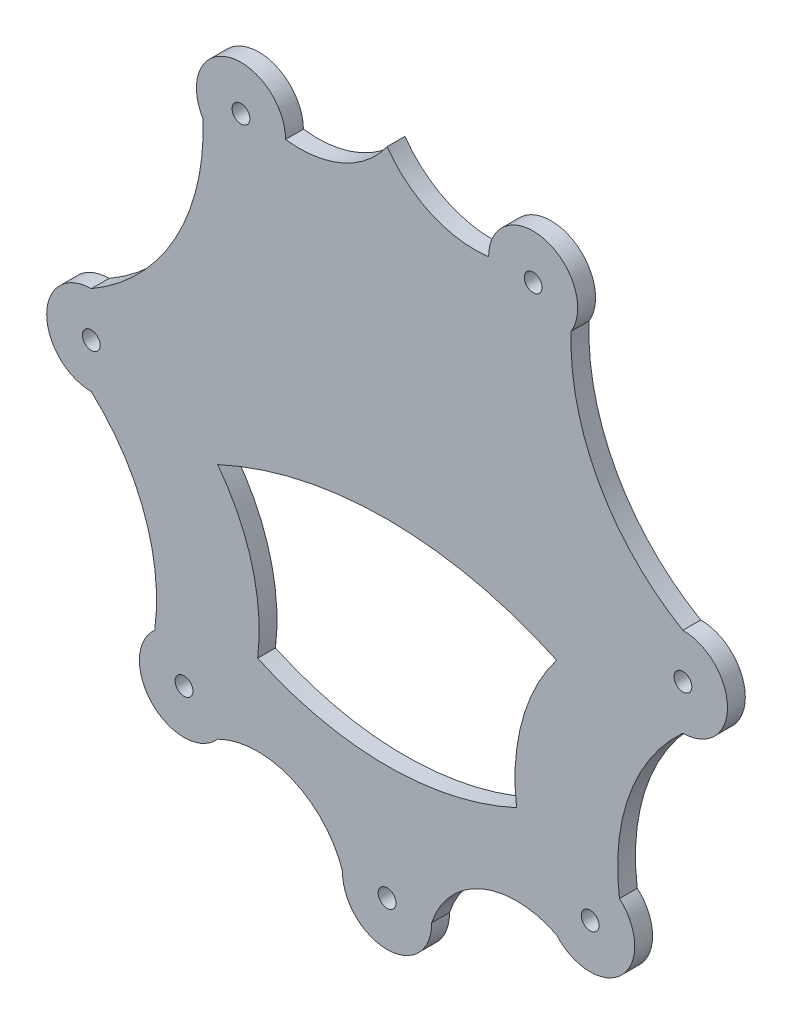
ISO-10303-21;
HEADER;
FILE_DESCRIPTION(('STEP AP214'),'2;1');
FILE_NAME('part.step','',(''),(''),'','','');
FILE_SCHEMA(('AUTOMOTIVE_DESIGN { 1 0 10303 214 1 1 1 1 }'));
ENDSEC;
DATA;
#1=APPLICATION_CONTEXT('core data for automotive mechanical design processes');
#2=APPLICATION_PROTOCOL_DEFINITION('international standard','automotive_design',2000,#1);
#3=PRODUCT_CONTEXT('',#1,'mechanical');
#4=PRODUCT('Part','Part','',(#3));
#5=PRODUCT_RELATED_PRODUCT_CATEGORY('part','',(#4));
#6=PRODUCT_DEFINITION_FORMATION('','',#4);
#7=PRODUCT_DEFINITION_CONTEXT('part definition',#1,'design');
#8=PRODUCT_DEFINITION('design','',#6,#7);
#9=PRODUCT_DEFINITION_SHAPE('','',#8);
#10=(LENGTH_UNIT() NAMED_UNIT(*) SI_UNIT(.MILLI.,.METRE.));
#11=(NAMED_UNIT(*) PLANE_ANGLE_UNIT() SI_UNIT($,.RADIAN.));
#12=(NAMED_UNIT(*) SI_UNIT($,.STERADIAN.) SOLID_ANGLE_UNIT());
#13=UNCERTAINTY_MEASURE_WITH_UNIT(LENGTH_MEASURE(1.E-05),#10,'distance_accuracy_value','');
#14=(GEOMETRIC_REPRESENTATION_CONTEXT(3) GLOBAL_UNCERTAINTY_ASSIGNED_CONTEXT((#13)) GLOBAL_UNIT_ASSIGNED_CONTEXT((#10,
#11,#12)) REPRESENTATION_CONTEXT('',''));
#15=CARTESIAN_POINT('',(0.,0.,0.));
#16=DIRECTION('',(0.,0.,1.));
#17=DIRECTION('',(1.,0.,0.));
#18=AXIS2_PLACEMENT_3D('',#15,#16,#17);
#19=CARTESIAN_POINT('',(-46.0489013592421,105.344998508358,5.));
#20=DIRECTION('',(0.,0.,1.));
#21=DIRECTION('',(1.,0.,0.));
#22=AXIS2_PLACEMENT_3D('',#19,#20,#21);
#23=PLANE('',#22);
#24=CARTESIAN_POINT('',(-46.0179505234573,-4.84085994709758,5.));
#25=DIRECTION('',(0.,0.,-1.));
#26=DIRECTION('',(-1.,0.,0.));
#27=AXIS2_PLACEMENT_3D('',#24,#25,#26);
#28=CIRCLE('',#27,112.841701767067);
#29=CARTESIAN_POINT('',(-93.553180016707,97.5000000000013,5.));
#30=VERTEX_POINT('',#29);
#31=CARTESIAN_POINT('',(1.51727896979238,97.5000000000013,5.));
#32=VERTEX_POINT('',#31);
#33=EDGE_CURVE('E296',#30,#32,#28,.T.);
#34=ORIENTED_EDGE('',*,*,#33,.T.);
#35=CARTESIAN_POINT('',(46.6491521117731,63.0327668328125,5.));
#36=DIRECTION('',(0.,0.,-1.));
#37=DIRECTION('',(-1.,0.,0.));
#38=AXIS2_PLACEMENT_3D('',#35,#36,#37);
#39=CIRCLE('',#38,56.7879928814639);
#40=CARTESIAN_POINT('',(-9.70982053233424,56.0655336656249,5.));
#41=VERTEX_POINT('',#40);
#42=EDGE_CURVE('E293',#41,#32,#39,.T.);
#43=ORIENTED_EDGE('',*,*,#42,.F.);
#44=CARTESIAN_POINT('',(-46.0179505234573,134.202699744071,5.));
#45=DIRECTION('',(0.,0.,-1.));
#46=DIRECTION('',(-1.,0.,0.));
#47=AXIS2_PLACEMENT_3D('',#44,#45,#46);
#48=CIRCLE('',#47,86.1608787456518);
#49=CARTESIAN_POINT('',(-82.3260805145803,56.0655336656249,5.));
#50=VERTEX_POINT('',#49);
#51=EDGE_CURVE('E290',#41,#50,#48,.T.);
#52=ORIENTED_EDGE('',*,*,#51,.T.);
#53=CARTESIAN_POINT('',(-138.685053158688,63.0327668328125,5.));
#54=DIRECTION('',(0.,0.,-1.));
#55=DIRECTION('',(-1.,0.,0.));
#56=AXIS2_PLACEMENT_3D('',#53,#54,#55);
#57=CIRCLE('',#56,56.7879928814639);
#58=EDGE_CURVE('E300',#30,#50,#57,.T.);
#59=ORIENTED_EDGE('',*,*,#58,.F.);
#60=EDGE_LOOP('',(#34,#43,#52,#59));
#61=FACE_BOUND('',#60,.T.);
#62=CARTESIAN_POINT('',(-102.986841911195,38.9932047085217,5.));
#63=DIRECTION('',(0.,0.,-1.));
#64=DIRECTION('',(-1.,0.,0.));
#65=AXIS2_PLACEMENT_3D('',#62,#63,#64);
#66=CIRCLE('',#65,2.5);
#67=CARTESIAN_POINT('',(-105.486841911195,38.9932047085217,5.));
#68=VERTEX_POINT('',#67);
#69=EDGE_CURVE('E302',#68,#68,#66,.T.);
#70=ORIENTED_EDGE('',*,*,#69,.T.);
#71=EDGE_LOOP('',(#70));
#72=FACE_BOUND('',#71,.T.);
#73=CARTESIAN_POINT('',(-129.,110.,5.));
#74=DIRECTION('',(0.,0.,-1.));
#75=DIRECTION('',(-1.,0.,0.));
#76=AXIS2_PLACEMENT_3D('',#73,#74,#75);
#77=CIRCLE('',#76,2.5);
#78=CARTESIAN_POINT('',(-131.5,110.,5.));
#79=VERTEX_POINT('',#78);
#80=EDGE_CURVE('E305',#79,#79,#77,.T.);
#81=ORIENTED_EDGE('',*,*,#80,.T.);
#82=EDGE_LOOP('',(#81));
#83=FACE_BOUND('',#82,.T.);
#84=CARTESIAN_POINT('',(-87.,186.,5.));
#85=DIRECTION('',(0.,0.,-1.));
#86=DIRECTION('',(-1.,0.,0.));
#87=AXIS2_PLACEMENT_3D('',#84,#85,#86);
#88=CIRCLE('',#87,2.5);
#89=CARTESIAN_POINT('',(-89.5,186.,5.));
#90=VERTEX_POINT('',#89);
#91=EDGE_CURVE('E308',#90,#90,#88,.T.);
#92=ORIENTED_EDGE('',*,*,#91,.T.);
#93=EDGE_LOOP('',(#92));
#94=FACE_BOUND('',#93,.T.);
#95=CARTESIAN_POINT('',(-46.0179505234573,15.949312442422,5.));
#96=DIRECTION('',(0.,0.,-1.));
#97=DIRECTION('',(-1.,0.,0.));
#98=AXIS2_PLACEMENT_3D('',#95,#96,#97);
#99=CIRCLE('',#98,2.5);
#100=CARTESIAN_POINT('',(-48.5179505234573,15.949312442422,5.));
#101=VERTEX_POINT('',#100);
#102=EDGE_CURVE('E311',#101,#101,#99,.T.);
#103=ORIENTED_EDGE('',*,*,#102,.T.);
#104=EDGE_LOOP('',(#103));
#105=FACE_BOUND('',#104,.T.);
#106=CARTESIAN_POINT('',(10.9509408642802,38.9932047085217,5.));
#107=DIRECTION('',(0.,0.,-1.));
#108=DIRECTION('',(-1.,0.,0.));
#109=AXIS2_PLACEMENT_3D('',#106,#107,#108);
#110=CIRCLE('',#109,2.5);
#111=CARTESIAN_POINT('',(8.45094086428022,38.9932047085217,5.));
#112=VERTEX_POINT('',#111);
#113=EDGE_CURVE('E314',#112,#112,#110,.T.);
#114=ORIENTED_EDGE('',*,*,#113,.T.);
#115=EDGE_LOOP('',(#114));
#116=FACE_BOUND('',#115,.T.);
#117=CARTESIAN_POINT('',(-5.03590104691458,186.,5.));
#118=DIRECTION('',(0.,0.,-1.));
#119=DIRECTION('',(-1.,0.,0.));
#120=AXIS2_PLACEMENT_3D('',#117,#118,#119);
#121=CIRCLE('',#120,2.5);
#122=CARTESIAN_POINT('',(-7.53590104691458,186.,5.));
#123=VERTEX_POINT('',#122);
#124=EDGE_CURVE('E316',#123,#123,#121,.T.);
#125=ORIENTED_EDGE('',*,*,#124,.T.);
#126=EDGE_LOOP('',(#125));
#127=FACE_BOUND('',#126,.T.);
#128=CARTESIAN_POINT('',(36.9640989530854,110.,5.));
#129=DIRECTION('',(0.,0.,-1.));
#130=DIRECTION('',(-1.,0.,0.));
#131=AXIS2_PLACEMENT_3D('',#128,#129,#130);
#132=CIRCLE('',#131,2.5);
#133=CARTESIAN_POINT('',(34.4640989530854,110.,5.));
#134=VERTEX_POINT('',#133);
#135=EDGE_CURVE('E160',#134,#134,#132,.T.);
#136=ORIENTED_EDGE('',*,*,#135,.T.);
#137=EDGE_LOOP('',(#136));
#138=FACE_BOUND('',#137,.T.);
#139=CARTESIAN_POINT('',(-70.5892479757029,215.788187083648,5.));
#140=DIRECTION('',(0.,0.,1.));
#141=DIRECTION('',(1.,0.,0.));
#142=AXIS2_PLACEMENT_3D('',#139,#140,#141);
#143=CIRCLE('',#142,30.0438025410554);
#144=CARTESIAN_POINT('',(-46.0179505234573,198.5,5.));
#145=VERTEX_POINT('',#144);
#146=CARTESIAN_POINT('',(-74.5,186.,5.));
#147=VERTEX_POINT('',#146);
#148=EDGE_CURVE('E177',#145,#147,#143,.F.);
#149=ORIENTED_EDGE('',*,*,#148,.T.);
#150=CARTESIAN_POINT('',(-87.,186.,5.));
#151=DIRECTION('',(0.,0.,1.));
#152=DIRECTION('',(1.,0.,0.));
#153=AXIS2_PLACEMENT_3D('',#150,#151,#152);
#154=CIRCLE('',#153,12.5);
#155=CARTESIAN_POINT('',(-97.6699129534475,179.488244663238,5.));
#156=VERTEX_POINT('',#155);
#157=EDGE_CURVE('E174',#156,#147,#154,.F.);
#158=ORIENTED_EDGE('',*,*,#157,.F.);
#159=CARTESIAN_POINT('',(-160.416977120088,176.878123739293,5.));
#160=DIRECTION('',(0.,0.,1.));
#161=DIRECTION('',(1.,0.,0.));
#162=AXIS2_PLACEMENT_3D('',#159,#160,#161);
#163=CIRCLE('',#162,62.8013279538742);
#164=CARTESIAN_POINT('',(-129.,122.499999999999,5.));
#165=VERTEX_POINT('',#164);
#166=EDGE_CURVE('E165',#156,#165,#163,.F.);
#167=ORIENTED_EDGE('',*,*,#166,.T.);
#168=CARTESIAN_POINT('',(-129.,110.,5.));
#169=DIRECTION('',(0.,0.,1.));
#170=DIRECTION('',(1.,0.,0.));
#171=AXIS2_PLACEMENT_3D('',#168,#169,#170);
#172=CIRCLE('',#171,12.4999999999988);
#173=CARTESIAN_POINT('',(-129.,97.5000000000013,5.));
#174=VERTEX_POINT('',#173);
#175=EDGE_CURVE('E156',#174,#165,#172,.F.);
#176=ORIENTED_EDGE('',*,*,#175,.F.);
#177=CARTESIAN_POINT('',(-166.683339145852,56.0655336656249,5.));
#178=DIRECTION('',(0.,0.,1.));
#179=DIRECTION('',(1.,0.,0.));
#180=AXIS2_PLACEMENT_3D('',#177,#178,#179);
#181=CIRCLE('',#180,56.0075802869209);
#182=CARTESIAN_POINT('',(-111.200647436843,48.4156990060434,5.));
#183=VERTEX_POINT('',#182);
#184=EDGE_CURVE('E19',#174,#183,#181,.F.);
#185=ORIENTED_EDGE('',*,*,#184,.T.);
#186=CARTESIAN_POINT('',(-102.986841911195,38.9932047085217,5.));
#187=DIRECTION('',(0.,0.,1.));
#188=DIRECTION('',(1.,0.,0.));
#189=AXIS2_PLACEMENT_3D('',#186,#187,#188);
#190=CIRCLE('',#189,12.5);
#191=CARTESIAN_POINT('',(-93.553180016707,30.7922277386425,5.));
#192=VERTEX_POINT('',#191);
#193=EDGE_CURVE('E153',#192,#183,#190,.F.);
#194=ORIENTED_EDGE('',*,*,#193,.F.);
#195=CARTESIAN_POINT('',(-82.3260805145803,8.38866064549752,5.));
#196=DIRECTION('',(0.,0.,1.));
#197=DIRECTION('',(1.,0.,0.));
#198=AXIS2_PLACEMENT_3D('',#195,#196,#197);
#199=CIRCLE('',#198,25.0592813489873);
#200=CARTESIAN_POINT('',(-58.515431911795,16.2002286598195,5.));
#201=VERTEX_POINT('',#200);
#202=EDGE_CURVE('E207',#192,#201,#199,.F.);
#203=ORIENTED_EDGE('',*,*,#202,.T.);
#204=CARTESIAN_POINT('',(-46.0179505234573,15.949312442422,5.));
#205=DIRECTION('',(0.,0.,1.));
#206=DIRECTION('',(1.,0.,0.));
#207=AXIS2_PLACEMENT_3D('',#204,#205,#206);
#208=CIRCLE('',#207,12.5);
#209=CARTESIAN_POINT('',(-33.5204691351196,16.2002286598196,5.));
#210=VERTEX_POINT('',#209);
#211=EDGE_CURVE('E204',#210,#201,#208,.F.);
#212=ORIENTED_EDGE('',*,*,#211,.F.);
#213=CARTESIAN_POINT('',(-9.70982053233428,8.38866064549752,5.));
#214=DIRECTION('',(0.,0.,1.));
#215=DIRECTION('',(1.,0.,0.));
#216=AXIS2_PLACEMENT_3D('',#213,#214,#215);
#217=CIRCLE('',#216,25.0592813489873);
#218=CARTESIAN_POINT('',(1.51727896979237,30.7922277386425,5.));
#219=VERTEX_POINT('',#218);
#220=EDGE_CURVE('E200',#210,#219,#217,.F.);
#221=ORIENTED_EDGE('',*,*,#220,.T.);
#222=CARTESIAN_POINT('',(10.9509408642802,38.9932047085217,5.));
#223=DIRECTION('',(0.,0.,1.));
#224=DIRECTION('',(1.,0.,0.));
#225=AXIS2_PLACEMENT_3D('',#222,#223,#224);
#226=CIRCLE('',#225,12.5);
#227=CARTESIAN_POINT('',(19.1647463899285,48.4156990060434,5.));
#228=VERTEX_POINT('',#227);
#229=EDGE_CURVE('E197',#228,#219,#226,.F.);
#230=ORIENTED_EDGE('',*,*,#229,.F.);
#231=CARTESIAN_POINT('',(74.6474380989377,56.0655336656249,5.));
#232=DIRECTION('',(0.,0.,1.));
#233=DIRECTION('',(1.,0.,0.));
#234=AXIS2_PLACEMENT_3D('',#231,#232,#233);
#235=CIRCLE('',#234,56.0075802869209);
#236=CARTESIAN_POINT('',(36.9640989530854,97.5000000000013,5.));
#237=VERTEX_POINT('',#236);
#238=EDGE_CURVE('E193',#228,#237,#235,.F.);
#239=ORIENTED_EDGE('',*,*,#238,.T.);
#240=CARTESIAN_POINT('',(36.9640989530854,110.,5.));
#241=DIRECTION('',(0.,0.,1.));
#242=DIRECTION('',(1.,0.,0.));
#243=AXIS2_PLACEMENT_3D('',#240,#241,#242);
#244=CIRCLE('',#243,12.4999999999988);
#245=CARTESIAN_POINT('',(36.9640989530854,122.499999999999,5.));
#246=VERTEX_POINT('',#245);
#247=EDGE_CURVE('E190',#246,#237,#244,.F.);
#248=ORIENTED_EDGE('',*,*,#247,.F.);
#249=CARTESIAN_POINT('',(68.381076073173,176.878123739293,5.));
#250=DIRECTION('',(0.,0.,1.));
#251=DIRECTION('',(1.,0.,0.));
#252=AXIS2_PLACEMENT_3D('',#249,#250,#251);
#253=CIRCLE('',#252,62.8013279538742);
#254=CARTESIAN_POINT('',(5.63401190653296,179.488244663238,5.));
#255=VERTEX_POINT('',#254);
#256=EDGE_CURVE('E186',#246,#255,#253,.F.);
#257=ORIENTED_EDGE('',*,*,#256,.T.);
#258=CARTESIAN_POINT('',(-5.03590104691458,186.,5.));
#259=DIRECTION('',(0.,0.,1.));
#260=DIRECTION('',(1.,0.,0.));
#261=AXIS2_PLACEMENT_3D('',#258,#259,#260);
#262=CIRCLE('',#261,12.5);
#263=CARTESIAN_POINT('',(-17.5359010469146,186.,5.));
#264=VERTEX_POINT('',#263);
#265=EDGE_CURVE('E183',#264,#255,#262,.F.);
#266=ORIENTED_EDGE('',*,*,#265,.F.);
#267=CARTESIAN_POINT('',(-21.4466530712117,215.788187083648,5.));
#268=DIRECTION('',(0.,0.,1.));
#269=DIRECTION('',(1.,0.,0.));
#270=AXIS2_PLACEMENT_3D('',#267,#268,#269);
#271=CIRCLE('',#270,30.0438025410554);
#272=EDGE_CURVE('E180',#264,#145,#271,.F.);
#273=ORIENTED_EDGE('',*,*,#272,.T.);
#274=EDGE_LOOP('',(#149,#158,#167,#176,#185,#194,#203,#212,#221,#230,#239,#248,#257,#266,#273));
#275=FACE_BOUND('',#274,.T.);
#276=ADVANCED_FACE('F16',(#61,#72,#83,#94,#105,#116,#127,#138,#275),#23,.T.);
#277=CARTESIAN_POINT('',(-166.683339145852,56.0655336656249,0.));
#278=DIRECTION('',(0.,0.,1.));
#279=DIRECTION('',(1.,0.,0.));
#280=AXIS2_PLACEMENT_3D('',#277,#278,#279);
#281=CYLINDRICAL_SURFACE('',#280,56.0075802869209);
#282=DIRECTION('',(0.,0.,1.));
#283=VECTOR('',#282,1.);
#284=CARTESIAN_POINT('',(-129.,97.5000000000013,0.));
#285=LINE('',#284,#283);
#286=CARTESIAN_POINT('',(-129.,97.5000000000013,0.));
#287=VERTEX_POINT('',#286);
#288=EDGE_CURVE('E148',#287,#174,#285,.T.);
#289=ORIENTED_EDGE('',*,*,#288,.F.);
#290=CARTESIAN_POINT('',(-166.683339145852,56.0655336656249,0.));
#291=DIRECTION('',(0.,0.,1.));
#292=DIRECTION('',(1.,0.,0.));
#293=AXIS2_PLACEMENT_3D('',#290,#291,#292);
#294=CIRCLE('',#293,56.0075802869209);
#295=CARTESIAN_POINT('',(-111.200647436843,48.4156990060434,0.));
#296=VERTEX_POINT('',#295);
#297=EDGE_CURVE('E287',#287,#296,#294,.F.);
#298=ORIENTED_EDGE('',*,*,#297,.T.);
#299=DIRECTION('',(0.,0.,1.));
#300=VECTOR('',#299,1.);
#301=CARTESIAN_POINT('',(-111.200647436843,48.4156990060434,0.));
#302=LINE('',#301,#300);
#303=EDGE_CURVE('E150',#183,#296,#302,.F.);
#304=ORIENTED_EDGE('',*,*,#303,.F.);
#305=ORIENTED_EDGE('',*,*,#184,.F.);
#306=EDGE_LOOP('',(#289,#298,#304,#305));
#307=FACE_BOUND('',#306,.T.);
#308=ADVANCED_FACE('F146',(#307),#281,.F.);
#309=CARTESIAN_POINT('',(-102.986841911195,38.9932047085217,0.));
#310=DIRECTION('',(0.,0.,1.));
#311=DIRECTION('',(1.,0.,0.));
#312=AXIS2_PLACEMENT_3D('',#309,#310,#311);
#313=CYLINDRICAL_SURFACE('',#312,12.5);
#314=CARTESIAN_POINT('',(-102.986841911195,38.9932047085217,0.));
#315=DIRECTION('',(0.,0.,1.));
#316=DIRECTION('',(1.,0.,0.));
#317=AXIS2_PLACEMENT_3D('',#314,#315,#316);
#318=CIRCLE('',#317,12.5);
#319=CARTESIAN_POINT('',(-93.553180016707,30.7922277386425,0.));
#320=VERTEX_POINT('',#319);
#321=EDGE_CURVE('E285',#296,#320,#318,.T.);
#322=ORIENTED_EDGE('',*,*,#321,.T.);
#323=DIRECTION('',(0.,0.,1.));
#324=VECTOR('',#323,1.);
#325=CARTESIAN_POINT('',(-93.553180016707,30.7922277386425,0.));
#326=LINE('',#325,#324);
#327=EDGE_CURVE('E209',#320,#192,#326,.T.);
#328=ORIENTED_EDGE('',*,*,#327,.T.);
#329=ORIENTED_EDGE('',*,*,#193,.T.);
#330=ORIENTED_EDGE('',*,*,#303,.T.);
#331=EDGE_LOOP('',(#322,#328,#329,#330));
#332=FACE_BOUND('',#331,.T.);
#333=ADVANCED_FACE('F372',(#332),#313,.T.);
#334=CARTESIAN_POINT('',(-82.3260805145803,8.38866064549752,0.));
#335=DIRECTION('',(0.,0.,1.));
#336=DIRECTION('',(1.,0.,0.));
#337=AXIS2_PLACEMENT_3D('',#334,#335,#336);
#338=CYLINDRICAL_SURFACE('',#337,25.0592813489873);
#339=ORIENTED_EDGE('',*,*,#327,.F.);
#340=CARTESIAN_POINT('',(-82.3260805145803,8.38866064549752,0.));
#341=DIRECTION('',(0.,0.,1.));
#342=DIRECTION('',(1.,0.,0.));
#343=AXIS2_PLACEMENT_3D('',#340,#341,#342);
#344=CIRCLE('',#343,25.0592813489873);
#345=CARTESIAN_POINT('',(-58.515431911795,16.2002286598195,0.));
#346=VERTEX_POINT('',#345);
#347=EDGE_CURVE('E282',#320,#346,#344,.F.);
#348=ORIENTED_EDGE('',*,*,#347,.T.);
#349=DIRECTION('',(0.,0.,1.));
#350=VECTOR('',#349,1.);
#351=CARTESIAN_POINT('',(-58.515431911795,16.2002286598196,0.));
#352=LINE('',#351,#350);
#353=EDGE_CURVE('E206',#201,#346,#352,.F.);
#354=ORIENTED_EDGE('',*,*,#353,.F.);
#355=ORIENTED_EDGE('',*,*,#202,.F.);
#356=EDGE_LOOP('',(#339,#348,#354,#355));
#357=FACE_BOUND('',#356,.T.);
#358=ADVANCED_FACE('F371',(#357),#338,.F.);
#359=CARTESIAN_POINT('',(-46.0179505234573,15.949312442422,0.));
#360=DIRECTION('',(0.,0.,1.));
#361=DIRECTION('',(1.,0.,0.));
#362=AXIS2_PLACEMENT_3D('',#359,#360,#361);
#363=CYLINDRICAL_SURFACE('',#362,12.5);
#364=CARTESIAN_POINT('',(-46.0179505234573,15.949312442422,0.));
#365=DIRECTION('',(0.,0.,1.));
#366=DIRECTION('',(1.,0.,0.));
#367=AXIS2_PLACEMENT_3D('',#364,#365,#366);
#368=CIRCLE('',#367,12.5);
#369=CARTESIAN_POINT('',(-33.5204691351196,16.2002286598196,0.));
#370=VERTEX_POINT('',#369);
#371=EDGE_CURVE('E279',#346,#370,#368,.T.);
#372=ORIENTED_EDGE('',*,*,#371,.T.);
#373=DIRECTION('',(0.,0.,1.));
#374=VECTOR('',#373,1.);
#375=CARTESIAN_POINT('',(-33.5204691351196,16.2002286598196,0.));
#376=LINE('',#375,#374);
#377=EDGE_CURVE('E203',#370,#210,#376,.T.);
#378=ORIENTED_EDGE('',*,*,#377,.T.);
#379=ORIENTED_EDGE('',*,*,#211,.T.);
#380=ORIENTED_EDGE('',*,*,#353,.T.);
#381=EDGE_LOOP('',(#372,#378,#379,#380));
#382=FACE_BOUND('',#381,.T.);
#383=ADVANCED_FACE('F365',(#382),#363,.T.);
#384=CARTESIAN_POINT('',(-9.70982053233428,8.38866064549752,0.));
#385=DIRECTION('',(0.,0.,1.));
#386=DIRECTION('',(1.,0.,0.));
#387=AXIS2_PLACEMENT_3D('',#384,#385,#386);
#388=CYLINDRICAL_SURFACE('',#387,25.0592813489873);
#389=ORIENTED_EDGE('',*,*,#377,.F.);
#390=CARTESIAN_POINT('',(-9.70982053233428,8.38866064549752,0.));
#391=DIRECTION('',(0.,0.,1.));
#392=DIRECTION('',(1.,0.,0.));
#393=AXIS2_PLACEMENT_3D('',#390,#391,#392);
#394=CIRCLE('',#393,25.0592813489873);
#395=CARTESIAN_POINT('',(1.51727896979237,30.7922277386425,0.));
#396=VERTEX_POINT('',#395);
#397=EDGE_CURVE('E276',#370,#396,#394,.F.);
#398=ORIENTED_EDGE('',*,*,#397,.T.);
#399=DIRECTION('',(0.,0.,1.));
#400=VECTOR('',#399,1.);
#401=CARTESIAN_POINT('',(1.51727896979237,30.7922277386425,0.));
#402=LINE('',#401,#400);
#403=EDGE_CURVE('E199',#219,#396,#402,.F.);
#404=ORIENTED_EDGE('',*,*,#403,.F.);
#405=ORIENTED_EDGE('',*,*,#220,.F.);
#406=EDGE_LOOP('',(#389,#398,#404,#405));
#407=FACE_BOUND('',#406,.T.);
#408=ADVANCED_FACE('F384',(#407),#388,.F.);
#409=CARTESIAN_POINT('',(10.9509408642802,38.9932047085217,0.));
#410=DIRECTION('',(0.,0.,1.));
#411=DIRECTION('',(1.,0.,0.));
#412=AXIS2_PLACEMENT_3D('',#409,#410,#411);
#413=CYLINDRICAL_SURFACE('',#412,12.5);
#414=CARTESIAN_POINT('',(10.9509408642802,38.9932047085217,0.));
#415=DIRECTION('',(0.,0.,1.));
#416=DIRECTION('',(1.,0.,0.));
#417=AXIS2_PLACEMENT_3D('',#414,#415,#416);
#418=CIRCLE('',#417,12.5);
#419=CARTESIAN_POINT('',(19.1647463899285,48.4156990060434,0.));
#420=VERTEX_POINT('',#419);
#421=EDGE_CURVE('E273',#396,#420,#418,.T.);
#422=ORIENTED_EDGE('',*,*,#421,.T.);
#423=DIRECTION('',(0.,0.,1.));
#424=VECTOR('',#423,1.);
#425=CARTESIAN_POINT('',(19.1647463899285,48.4156990060434,0.));
#426=LINE('',#425,#424);
#427=EDGE_CURVE('E196',#420,#228,#426,.T.);
#428=ORIENTED_EDGE('',*,*,#427,.T.);
#429=ORIENTED_EDGE('',*,*,#229,.T.);
#430=ORIENTED_EDGE('',*,*,#403,.T.);
#431=EDGE_LOOP('',(#422,#428,#429,#430));
#432=FACE_BOUND('',#431,.T.);
#433=ADVANCED_FACE('F387',(#432),#413,.T.);
#434=CARTESIAN_POINT('',(74.6474380989377,56.0655336656249,0.));
#435=DIRECTION('',(0.,0.,1.));
#436=DIRECTION('',(1.,0.,0.));
#437=AXIS2_PLACEMENT_3D('',#434,#435,#436);
#438=CYLINDRICAL_SURFACE('',#437,56.0075802869209);
#439=ORIENTED_EDGE('',*,*,#427,.F.);
#440=CARTESIAN_POINT('',(74.6474380989377,56.0655336656249,0.));
#441=DIRECTION('',(0.,0.,1.));
#442=DIRECTION('',(1.,0.,0.));
#443=AXIS2_PLACEMENT_3D('',#440,#441,#442);
#444=CIRCLE('',#443,56.0075802869209);
#445=CARTESIAN_POINT('',(36.9640989530854,97.5000000000013,0.));
#446=VERTEX_POINT('',#445);
#447=EDGE_CURVE('E270',#420,#446,#444,.F.);
#448=ORIENTED_EDGE('',*,*,#447,.T.);
#449=DIRECTION('',(0.,0.,1.));
#450=VECTOR('',#449,1.);
#451=CARTESIAN_POINT('',(36.9640989530854,97.5000000000013,0.));
#452=LINE('',#451,#450);
#453=EDGE_CURVE('E192',#237,#446,#452,.F.);
#454=ORIENTED_EDGE('',*,*,#453,.F.);
#455=ORIENTED_EDGE('',*,*,#238,.F.);
#456=EDGE_LOOP('',(#439,#448,#454,#455));
#457=FACE_BOUND('',#456,.T.);
#458=ADVANCED_FACE('F391',(#457),#438,.F.);
#459=CARTESIAN_POINT('',(36.9640989530854,110.,0.));
#460=DIRECTION('',(0.,0.,1.));
#461=DIRECTION('',(1.,0.,0.));
#462=AXIS2_PLACEMENT_3D('',#459,#460,#461);
#463=CYLINDRICAL_SURFACE('',#462,12.4999999999988);
#464=CARTESIAN_POINT('',(36.9640989530854,110.,0.));
#465=DIRECTION('',(0.,0.,1.));
#466=DIRECTION('',(1.,0.,0.));
#467=AXIS2_PLACEMENT_3D('',#464,#465,#466);
#468=CIRCLE('',#467,12.4999999999988);
#469=CARTESIAN_POINT('',(36.9640989530855,122.499999999999,0.));
#470=VERTEX_POINT('',#469);
#471=EDGE_CURVE('E267',#446,#470,#468,.T.);
#472=ORIENTED_EDGE('',*,*,#471,.T.);
#473=DIRECTION('',(0.,0.,1.));
#474=VECTOR('',#473,1.);
#475=CARTESIAN_POINT('',(36.9640989530854,122.499999999999,0.));
#476=LINE('',#475,#474);
#477=EDGE_CURVE('E189',#470,#246,#476,.T.);
#478=ORIENTED_EDGE('',*,*,#477,.T.);
#479=ORIENTED_EDGE('',*,*,#247,.T.);
#480=ORIENTED_EDGE('',*,*,#453,.T.);
#481=EDGE_LOOP('',(#472,#478,#479,#480));
#482=FACE_BOUND('',#481,.T.);
#483=ADVANCED_FACE('F395',(#482),#463,.T.);
#484=CARTESIAN_POINT('',(68.381076073173,176.878123739293,0.));
#485=DIRECTION('',(0.,0.,1.));
#486=DIRECTION('',(1.,0.,0.));
#487=AXIS2_PLACEMENT_3D('',#484,#485,#486);
#488=CYLINDRICAL_SURFACE('',#487,62.8013279538742);
#489=ORIENTED_EDGE('',*,*,#477,.F.);
#490=CARTESIAN_POINT('',(68.381076073173,176.878123739293,0.));
#491=DIRECTION('',(0.,0.,1.));
#492=DIRECTION('',(1.,0.,0.));
#493=AXIS2_PLACEMENT_3D('',#490,#491,#492);
#494=CIRCLE('',#493,62.8013279538742);
#495=CARTESIAN_POINT('',(5.63401190653296,179.488244663238,0.));
#496=VERTEX_POINT('',#495);
#497=EDGE_CURVE('E264',#470,#496,#494,.F.);
#498=ORIENTED_EDGE('',*,*,#497,.T.);
#499=DIRECTION('',(0.,0.,1.));
#500=VECTOR('',#499,1.);
#501=CARTESIAN_POINT('',(5.63401190653297,179.488244663238,0.));
#502=LINE('',#501,#500);
#503=EDGE_CURVE('E185',#255,#496,#502,.F.);
#504=ORIENTED_EDGE('',*,*,#503,.F.);
#505=ORIENTED_EDGE('',*,*,#256,.F.);
#506=EDGE_LOOP('',(#489,#498,#504,#505));
#507=FACE_BOUND('',#506,.T.);
#508=ADVANCED_FACE('F399',(#507),#488,.F.);
#509=CARTESIAN_POINT('',(-5.03590104691458,186.,0.));
#510=DIRECTION('',(0.,0.,1.));
#511=DIRECTION('',(1.,0.,0.));
#512=AXIS2_PLACEMENT_3D('',#509,#510,#511);
#513=CYLINDRICAL_SURFACE('',#512,12.5);
#514=CARTESIAN_POINT('',(-5.03590104691458,186.,0.));
#515=DIRECTION('',(0.,0.,1.));
#516=DIRECTION('',(1.,0.,0.));
#517=AXIS2_PLACEMENT_3D('',#514,#515,#516);
#518=CIRCLE('',#517,12.5);
#519=CARTESIAN_POINT('',(-17.5359010469146,186.,0.));
#520=VERTEX_POINT('',#519);
#521=EDGE_CURVE('E261',#496,#520,#518,.T.);
#522=ORIENTED_EDGE('',*,*,#521,.T.);
#523=DIRECTION('',(0.,0.,1.));
#524=VECTOR('',#523,1.);
#525=CARTESIAN_POINT('',(-17.5359010469146,186.,0.));
#526=LINE('',#525,#524);
#527=EDGE_CURVE('E182',#520,#264,#526,.T.);
#528=ORIENTED_EDGE('',*,*,#527,.T.);
#529=ORIENTED_EDGE('',*,*,#265,.T.);
#530=ORIENTED_EDGE('',*,*,#503,.T.);
#531=EDGE_LOOP('',(#522,#528,#529,#530));
#532=FACE_BOUND('',#531,.T.);
#533=ADVANCED_FACE('F403',(#532),#513,.T.);
#534=CARTESIAN_POINT('',(-21.4466530712117,215.788187083648,0.));
#535=DIRECTION('',(0.,0.,1.));
#536=DIRECTION('',(1.,0.,0.));
#537=AXIS2_PLACEMENT_3D('',#534,#535,#536);
#538=CYLINDRICAL_SURFACE('',#537,30.0438025410554);
#539=ORIENTED_EDGE('',*,*,#527,.F.);
#540=CARTESIAN_POINT('',(-21.4466530712117,215.788187083648,0.));
#541=DIRECTION('',(0.,0.,1.));
#542=DIRECTION('',(1.,0.,0.));
#543=AXIS2_PLACEMENT_3D('',#540,#541,#542);
#544=CIRCLE('',#543,30.0438025410554);
#545=CARTESIAN_POINT('',(-46.0179505234573,198.5,0.));
#546=VERTEX_POINT('',#545);
#547=EDGE_CURVE('E258',#520,#546,#544,.F.);
#548=ORIENTED_EDGE('',*,*,#547,.T.);
#549=DIRECTION('',(0.,0.,1.));
#550=VECTOR('',#549,1.);
#551=CARTESIAN_POINT('',(-46.0179505234573,198.5,0.));
#552=LINE('',#551,#550);
#553=EDGE_CURVE('E179',#546,#145,#552,.T.);
#554=ORIENTED_EDGE('',*,*,#553,.T.);
#555=ORIENTED_EDGE('',*,*,#272,.F.);
#556=EDGE_LOOP('',(#539,#548,#554,#555));
#557=FACE_BOUND('',#556,.T.);
#558=ADVANCED_FACE('F407',(#557),#538,.F.);
#559=CARTESIAN_POINT('',(-70.5892479757029,215.788187083648,0.));
#560=DIRECTION('',(0.,0.,1.));
#561=DIRECTION('',(1.,0.,0.));
#562=AXIS2_PLACEMENT_3D('',#559,#560,#561);
#563=CYLINDRICAL_SURFACE('',#562,30.0438025410554);
#564=ORIENTED_EDGE('',*,*,#553,.F.);
#565=CARTESIAN_POINT('',(-70.5892479757029,215.788187083648,0.));
#566=DIRECTION('',(0.,0.,1.));
#567=DIRECTION('',(1.,0.,0.));
#568=AXIS2_PLACEMENT_3D('',#565,#566,#567);
#569=CIRCLE('',#568,30.0438025410554);
#570=CARTESIAN_POINT('',(-74.5,186.,0.));
#571=VERTEX_POINT('',#570);
#572=EDGE_CURVE('E255',#546,#571,#569,.F.);
#573=ORIENTED_EDGE('',*,*,#572,.T.);
#574=DIRECTION('',(0.,0.,1.));
#575=VECTOR('',#574,1.);
#576=CARTESIAN_POINT('',(-74.5,186.,0.));
#577=LINE('',#576,#575);
#578=EDGE_CURVE('E176',#147,#571,#577,.F.);
#579=ORIENTED_EDGE('',*,*,#578,.F.);
#580=ORIENTED_EDGE('',*,*,#148,.F.);
#581=EDGE_LOOP('',(#564,#573,#579,#580));
#582=FACE_BOUND('',#581,.T.);
#583=ADVANCED_FACE('F411',(#582),#563,.F.);
#584=CARTESIAN_POINT('',(-87.,186.,0.));
#585=DIRECTION('',(0.,0.,1.));
#586=DIRECTION('',(1.,0.,0.));
#587=AXIS2_PLACEMENT_3D('',#584,#585,#586);
#588=CYLINDRICAL_SURFACE('',#587,12.5);
#589=CARTESIAN_POINT('',(-87.,186.,0.));
#590=DIRECTION('',(0.,0.,1.));
#591=DIRECTION('',(1.,0.,0.));
#592=AXIS2_PLACEMENT_3D('',#589,#590,#591);
#593=CIRCLE('',#592,12.5);
#594=CARTESIAN_POINT('',(-97.6699129534475,179.488244663238,0.));
#595=VERTEX_POINT('',#594);
#596=EDGE_CURVE('E252',#571,#595,#593,.T.);
#597=ORIENTED_EDGE('',*,*,#596,.T.);
#598=DIRECTION('',(0.,0.,1.));
#599=VECTOR('',#598,1.);
#600=CARTESIAN_POINT('',(-97.6699129534475,179.488244663238,0.));
#601=LINE('',#600,#599);
#602=EDGE_CURVE('E169',#595,#156,#601,.T.);
#603=ORIENTED_EDGE('',*,*,#602,.T.);
#604=ORIENTED_EDGE('',*,*,#157,.T.);
#605=ORIENTED_EDGE('',*,*,#578,.T.);
#606=EDGE_LOOP('',(#597,#603,#604,#605));
#607=FACE_BOUND('',#606,.T.);
#608=ADVANCED_FACE('F343',(#607),#588,.T.);
#609=CARTESIAN_POINT('',(-160.416977120088,176.878123739293,0.));
#610=DIRECTION('',(0.,0.,1.));
#611=DIRECTION('',(1.,0.,0.));
#612=AXIS2_PLACEMENT_3D('',#609,#610,#611);
#613=CYLINDRICAL_SURFACE('',#612,62.8013279538742);
#614=ORIENTED_EDGE('',*,*,#602,.F.);
#615=CARTESIAN_POINT('',(-160.416977120088,176.878123739293,0.));
#616=DIRECTION('',(0.,0.,1.));
#617=DIRECTION('',(1.,0.,0.));
#618=AXIS2_PLACEMENT_3D('',#615,#616,#617);
#619=CIRCLE('',#618,62.8013279538742);
#620=CARTESIAN_POINT('',(-129.,122.499999999999,0.));
#621=VERTEX_POINT('',#620);
#622=EDGE_CURVE('E249',#595,#621,#619,.F.);
#623=ORIENTED_EDGE('',*,*,#622,.T.);
#624=DIRECTION('',(0.,0.,1.));
#625=VECTOR('',#624,1.);
#626=CARTESIAN_POINT('',(-129.,122.499999999999,0.));
#627=LINE('',#626,#625);
#628=EDGE_CURVE('E161',#165,#621,#627,.F.);
#629=ORIENTED_EDGE('',*,*,#628,.F.);
#630=ORIENTED_EDGE('',*,*,#166,.F.);
#631=EDGE_LOOP('',(#614,#623,#629,#630));
#632=FACE_BOUND('',#631,.T.);
#633=ADVANCED_FACE('F417',(#632),#613,.F.);
#634=CARTESIAN_POINT('',(-129.,110.,0.));
#635=DIRECTION('',(0.,0.,1.));
#636=DIRECTION('',(1.,0.,0.));
#637=AXIS2_PLACEMENT_3D('',#634,#635,#636);
#638=CYLINDRICAL_SURFACE('',#637,12.4999999999988);
#639=CARTESIAN_POINT('',(-129.,110.,0.));
#640=DIRECTION('',(0.,0.,1.));
#641=DIRECTION('',(1.,0.,0.));
#642=AXIS2_PLACEMENT_3D('',#639,#640,#641);
#643=CIRCLE('',#642,12.4999999999988);
#644=EDGE_CURVE('E159',#621,#287,#643,.T.);
#645=ORIENTED_EDGE('',*,*,#644,.T.);
#646=ORIENTED_EDGE('',*,*,#288,.T.);
#647=ORIENTED_EDGE('',*,*,#175,.T.);
#648=ORIENTED_EDGE('',*,*,#628,.T.);
#649=EDGE_LOOP('',(#645,#646,#647,#648));
#650=FACE_BOUND('',#649,.T.);
#651=ADVANCED_FACE('F155',(#650),#638,.T.);
#652=CARTESIAN_POINT('',(36.9640989530854,110.,5.));
#653=DIRECTION('',(0.,0.,-1.));
#654=DIRECTION('',(-1.,0.,0.));
#655=AXIS2_PLACEMENT_3D('',#652,#653,#654);
#656=CYLINDRICAL_SURFACE('',#655,2.5);
#657=ORIENTED_EDGE('',*,*,#135,.F.);
#658=EDGE_LOOP('',(#657));
#659=FACE_BOUND('',#658,.T.);
#660=CARTESIAN_POINT('',(36.9640989530854,110.,0.));
#661=DIRECTION('',(0.,0.,-1.));
#662=DIRECTION('',(-1.,0.,0.));
#663=AXIS2_PLACEMENT_3D('',#660,#661,#662);
#664=CIRCLE('',#663,2.5);
#665=CARTESIAN_POINT('',(34.4640989530854,110.,0.));
#666=VERTEX_POINT('',#665);
#667=EDGE_CURVE('E245',#666,#666,#664,.T.);
#668=ORIENTED_EDGE('',*,*,#667,.T.);
#669=EDGE_LOOP('',(#668));
#670=FACE_BOUND('',#669,.T.);
#671=ADVANCED_FACE('F324',(#659,#670),#656,.F.);
#672=CARTESIAN_POINT('',(-5.03590104691458,186.,5.));
#673=DIRECTION('',(0.,0.,-1.));
#674=DIRECTION('',(-1.,0.,0.));
#675=AXIS2_PLACEMENT_3D('',#672,#673,#674);
#676=CYLINDRICAL_SURFACE('',#675,2.5);
#677=ORIENTED_EDGE('',*,*,#124,.F.);
#678=EDGE_LOOP('',(#677));
#679=FACE_BOUND('',#678,.T.);
#680=CARTESIAN_POINT('',(-5.03590104691458,186.,0.));
#681=DIRECTION('',(0.,0.,-1.));
#682=DIRECTION('',(-1.,0.,0.));
#683=AXIS2_PLACEMENT_3D('',#680,#681,#682);
#684=CIRCLE('',#683,2.5);
#685=CARTESIAN_POINT('',(-7.53590104691458,186.,0.));
#686=VERTEX_POINT('',#685);
#687=EDGE_CURVE('E242',#686,#686,#684,.T.);
#688=ORIENTED_EDGE('',*,*,#687,.T.);
#689=EDGE_LOOP('',(#688));
#690=FACE_BOUND('',#689,.T.);
#691=ADVANCED_FACE('F327',(#679,#690),#676,.F.);
#692=CARTESIAN_POINT('',(10.9509408642802,38.9932047085217,5.));
#693=DIRECTION('',(0.,0.,-1.));
#694=DIRECTION('',(-1.,0.,0.));
#695=AXIS2_PLACEMENT_3D('',#692,#693,#694);
#696=CYLINDRICAL_SURFACE('',#695,2.5);
#697=ORIENTED_EDGE('',*,*,#113,.F.);
#698=EDGE_LOOP('',(#697));
#699=FACE_BOUND('',#698,.T.);
#700=CARTESIAN_POINT('',(10.9509408642802,38.9932047085217,0.));
#701=DIRECTION('',(0.,0.,-1.));
#702=DIRECTION('',(-1.,0.,0.));
#703=AXIS2_PLACEMENT_3D('',#700,#701,#702);
#704=CIRCLE('',#703,2.5);
#705=CARTESIAN_POINT('',(8.45094086428022,38.9932047085217,0.));
#706=VERTEX_POINT('',#705);
#707=EDGE_CURVE('E239',#706,#706,#704,.T.);
#708=ORIENTED_EDGE('',*,*,#707,.T.);
#709=EDGE_LOOP('',(#708));
#710=FACE_BOUND('',#709,.T.);
#711=ADVANCED_FACE('F424',(#699,#710),#696,.F.);
#712=CARTESIAN_POINT('',(-46.0179505234573,15.949312442422,5.));
#713=DIRECTION('',(0.,0.,-1.));
#714=DIRECTION('',(-1.,0.,0.));
#715=AXIS2_PLACEMENT_3D('',#712,#713,#714);
#716=CYLINDRICAL_SURFACE('',#715,2.5);
#717=ORIENTED_EDGE('',*,*,#102,.F.);
#718=EDGE_LOOP('',(#717));
#719=FACE_BOUND('',#718,.T.);
#720=CARTESIAN_POINT('',(-46.0179505234573,15.949312442422,0.));
#721=DIRECTION('',(0.,0.,-1.));
#722=DIRECTION('',(-1.,0.,0.));
#723=AXIS2_PLACEMENT_3D('',#720,#721,#722);
#724=CIRCLE('',#723,2.5);
#725=CARTESIAN_POINT('',(-48.5179505234573,15.949312442422,0.));
#726=VERTEX_POINT('',#725);
#727=EDGE_CURVE('E236',#726,#726,#724,.T.);
#728=ORIENTED_EDGE('',*,*,#727,.T.);
#729=EDGE_LOOP('',(#728));
#730=FACE_BOUND('',#729,.T.);
#731=ADVANCED_FACE('F428',(#719,#730),#716,.F.);
#732=CARTESIAN_POINT('',(-87.,186.,5.));
#733=DIRECTION('',(0.,0.,-1.));
#734=DIRECTION('',(-1.,0.,0.));
#735=AXIS2_PLACEMENT_3D('',#732,#733,#734);
#736=CYLINDRICAL_SURFACE('',#735,2.5);
#737=ORIENTED_EDGE('',*,*,#91,.F.);
#738=EDGE_LOOP('',(#737));
#739=FACE_BOUND('',#738,.T.);
#740=CARTESIAN_POINT('',(-87.,186.,0.));
#741=DIRECTION('',(0.,0.,-1.));
#742=DIRECTION('',(-1.,0.,0.));
#743=AXIS2_PLACEMENT_3D('',#740,#741,#742);
#744=CIRCLE('',#743,2.5);
#745=CARTESIAN_POINT('',(-89.5,186.,0.));
#746=VERTEX_POINT('',#745);
#747=EDGE_CURVE('E233',#746,#746,#744,.T.);
#748=ORIENTED_EDGE('',*,*,#747,.T.);
#749=EDGE_LOOP('',(#748));
#750=FACE_BOUND('',#749,.T.);
#751=ADVANCED_FACE('F432',(#739,#750),#736,.F.);
#752=CARTESIAN_POINT('',(-129.,110.,5.));
#753=DIRECTION('',(0.,0.,-1.));
#754=DIRECTION('',(-1.,0.,0.));
#755=AXIS2_PLACEMENT_3D('',#752,#753,#754);
#756=CYLINDRICAL_SURFACE('',#755,2.5);
#757=ORIENTED_EDGE('',*,*,#80,.F.);
#758=EDGE_LOOP('',(#757));
#759=FACE_BOUND('',#758,.T.);
#760=CARTESIAN_POINT('',(-129.,110.,0.));
#761=DIRECTION('',(0.,0.,-1.));
#762=DIRECTION('',(-1.,0.,0.));
#763=AXIS2_PLACEMENT_3D('',#760,#761,#762);
#764=CIRCLE('',#763,2.5);
#765=CARTESIAN_POINT('',(-131.5,110.,0.));
#766=VERTEX_POINT('',#765);
#767=EDGE_CURVE('E230',#766,#766,#764,.T.);
#768=ORIENTED_EDGE('',*,*,#767,.T.);
#769=EDGE_LOOP('',(#768));
#770=FACE_BOUND('',#769,.T.);
#771=ADVANCED_FACE('F436',(#759,#770),#756,.F.);
#772=CARTESIAN_POINT('',(-102.986841911195,38.9932047085217,5.));
#773=DIRECTION('',(0.,0.,-1.));
#774=DIRECTION('',(-1.,0.,0.));
#775=AXIS2_PLACEMENT_3D('',#772,#773,#774);
#776=CYLINDRICAL_SURFACE('',#775,2.5);
#777=ORIENTED_EDGE('',*,*,#69,.F.);
#778=EDGE_LOOP('',(#777));
#779=FACE_BOUND('',#778,.T.);
#780=CARTESIAN_POINT('',(-102.986841911195,38.9932047085217,0.));
#781=DIRECTION('',(0.,0.,-1.));
#782=DIRECTION('',(-1.,0.,0.));
#783=AXIS2_PLACEMENT_3D('',#780,#781,#782);
#784=CIRCLE('',#783,2.5);
#785=CARTESIAN_POINT('',(-105.486841911195,38.9932047085217,0.));
#786=VERTEX_POINT('',#785);
#787=EDGE_CURVE('E227',#786,#786,#784,.T.);
#788=ORIENTED_EDGE('',*,*,#787,.T.);
#789=EDGE_LOOP('',(#788));
#790=FACE_BOUND('',#789,.T.);
#791=ADVANCED_FACE('F440',(#779,#790),#776,.F.);
#792=CARTESIAN_POINT('',(-138.685053158688,63.0327668328125,5.));
#793=DIRECTION('',(0.,0.,-1.));
#794=DIRECTION('',(-1.,0.,0.));
#795=AXIS2_PLACEMENT_3D('',#792,#793,#794);
#796=CYLINDRICAL_SURFACE('',#795,56.7879928814639);
#797=ORIENTED_EDGE('',*,*,#58,.T.);
#798=DIRECTION('',(0.,0.,-1.));
#799=VECTOR('',#798,1.);
#800=CARTESIAN_POINT('',(-82.3260805145803,56.0655336656249,5.));
#801=LINE('',#800,#799);
#802=CARTESIAN_POINT('',(-82.3260805145803,56.0655336656249,0.));
#803=VERTEX_POINT('',#802);
#804=EDGE_CURVE('E289',#50,#803,#801,.T.);
#805=ORIENTED_EDGE('',*,*,#804,.T.);
#806=CARTESIAN_POINT('',(-138.685053158688,63.0327668328125,0.));
#807=DIRECTION('',(0.,0.,-1.));
#808=DIRECTION('',(-1.,0.,0.));
#809=AXIS2_PLACEMENT_3D('',#806,#807,#808);
#810=CIRCLE('',#809,56.7879928814639);
#811=CARTESIAN_POINT('',(-93.553180016707,97.5000000000013,0.));
#812=VERTEX_POINT('',#811);
#813=EDGE_CURVE('E224',#803,#812,#810,.F.);
#814=ORIENTED_EDGE('',*,*,#813,.T.);
#815=DIRECTION('',(0.,0.,-1.));
#816=VECTOR('',#815,1.);
#817=CARTESIAN_POINT('',(-93.553180016707,97.5000000000013,5.));
#818=LINE('',#817,#816);
#819=EDGE_CURVE('E299',#812,#30,#818,.F.);
#820=ORIENTED_EDGE('',*,*,#819,.T.);
#821=EDGE_LOOP('',(#797,#805,#814,#820));
#822=FACE_BOUND('',#821,.T.);
#823=ADVANCED_FACE('F444',(#822),#796,.T.);
#824=CARTESIAN_POINT('',(-46.0179505234573,-4.84085994709758,5.));
#825=DIRECTION('',(0.,0.,-1.));
#826=DIRECTION('',(-1.,0.,0.));
#827=AXIS2_PLACEMENT_3D('',#824,#825,#826);
#828=CYLINDRICAL_SURFACE('',#827,112.841701767067);
#829=DIRECTION('',(0.,0.,-1.));
#830=VECTOR('',#829,1.);
#831=CARTESIAN_POINT('',(1.51727896979238,97.5000000000013,5.));
#832=LINE('',#831,#830);
#833=CARTESIAN_POINT('',(1.51727896979238,97.5000000000013,0.));
#834=VERTEX_POINT('',#833);
#835=EDGE_CURVE('E295',#32,#834,#832,.T.);
#836=ORIENTED_EDGE('',*,*,#835,.F.);
#837=ORIENTED_EDGE('',*,*,#33,.F.);
#838=ORIENTED_EDGE('',*,*,#819,.F.);
#839=CARTESIAN_POINT('',(-46.0179505234573,-4.84085994709758,0.));
#840=DIRECTION('',(0.,0.,-1.));
#841=DIRECTION('',(-1.,0.,0.));
#842=AXIS2_PLACEMENT_3D('',#839,#840,#841);
#843=CIRCLE('',#842,112.841701767067);
#844=EDGE_CURVE('E221',#812,#834,#843,.T.);
#845=ORIENTED_EDGE('',*,*,#844,.T.);
#846=EDGE_LOOP('',(#836,#837,#838,#845));
#847=FACE_BOUND('',#846,.T.);
#848=ADVANCED_FACE('F448',(#847),#828,.F.);
#849=CARTESIAN_POINT('',(46.6491521117731,63.0327668328125,5.));
#850=DIRECTION('',(0.,0.,-1.));
#851=DIRECTION('',(-1.,0.,0.));
#852=AXIS2_PLACEMENT_3D('',#849,#850,#851);
#853=CYLINDRICAL_SURFACE('',#852,56.7879928814639);
#854=ORIENTED_EDGE('',*,*,#42,.T.);
#855=ORIENTED_EDGE('',*,*,#835,.T.);
#856=CARTESIAN_POINT('',(46.6491521117731,63.0327668328125,0.));
#857=DIRECTION('',(0.,0.,-1.));
#858=DIRECTION('',(-1.,0.,0.));
#859=AXIS2_PLACEMENT_3D('',#856,#857,#858);
#860=CIRCLE('',#859,56.7879928814639);
#861=CARTESIAN_POINT('',(-9.70982053233425,56.0655336656249,0.));
#862=VERTEX_POINT('',#861);
#863=EDGE_CURVE('E25',#834,#862,#860,.F.);
#864=ORIENTED_EDGE('',*,*,#863,.T.);
#865=DIRECTION('',(0.,0.,-1.));
#866=VECTOR('',#865,1.);
#867=CARTESIAN_POINT('',(-9.70982053233423,56.0655336656249,5.));
#868=LINE('',#867,#866);
#869=EDGE_CURVE('E33',#862,#41,#868,.F.);
#870=ORIENTED_EDGE('',*,*,#869,.T.);
#871=EDGE_LOOP('',(#854,#855,#864,#870));
#872=FACE_BOUND('',#871,.T.);
#873=ADVANCED_FACE('F452',(#872),#853,.T.);
#874=CARTESIAN_POINT('',(-46.0179505234573,134.202699744071,5.));
#875=DIRECTION('',(0.,0.,-1.));
#876=DIRECTION('',(-1.,0.,0.));
#877=AXIS2_PLACEMENT_3D('',#874,#875,#876);
#878=CYLINDRICAL_SURFACE('',#877,86.1608787456518);
#879=ORIENTED_EDGE('',*,*,#804,.F.);
#880=ORIENTED_EDGE('',*,*,#51,.F.);
#881=ORIENTED_EDGE('',*,*,#869,.F.);
#882=CARTESIAN_POINT('',(-46.0179505234573,134.202699744071,0.));
#883=DIRECTION('',(0.,0.,-1.));
#884=DIRECTION('',(-1.,0.,0.));
#885=AXIS2_PLACEMENT_3D('',#882,#883,#884);
#886=CIRCLE('',#885,86.1608787456518);
#887=EDGE_CURVE('E11',#862,#803,#886,.T.);
#888=ORIENTED_EDGE('',*,*,#887,.T.);
#889=EDGE_LOOP('',(#879,#880,#881,#888));
#890=FACE_BOUND('',#889,.T.);
#891=ADVANCED_FACE('F334',(#890),#878,.F.);
#892=CARTESIAN_POINT('',(-46.0489013592421,105.344998508358,0.));
#893=DIRECTION('',(0.,0.,1.));
#894=DIRECTION('',(1.,0.,0.));
#895=AXIS2_PLACEMENT_3D('',#892,#893,#894);
#896=PLANE('',#895);
#897=ORIENTED_EDGE('',*,*,#863,.F.);
#898=ORIENTED_EDGE('',*,*,#844,.F.);
#899=ORIENTED_EDGE('',*,*,#813,.F.);
#900=ORIENTED_EDGE('',*,*,#887,.F.);
#901=EDGE_LOOP('',(#897,#898,#899,#900));
#902=FACE_BOUND('',#901,.T.);
#903=ORIENTED_EDGE('',*,*,#787,.F.);
#904=EDGE_LOOP('',(#903));
#905=FACE_BOUND('',#904,.T.);
#906=ORIENTED_EDGE('',*,*,#767,.F.);
#907=EDGE_LOOP('',(#906));
#908=FACE_BOUND('',#907,.T.);
#909=ORIENTED_EDGE('',*,*,#747,.F.);
#910=EDGE_LOOP('',(#909));
#911=FACE_BOUND('',#910,.T.);
#912=ORIENTED_EDGE('',*,*,#727,.F.);
#913=EDGE_LOOP('',(#912));
#914=FACE_BOUND('',#913,.T.);
#915=ORIENTED_EDGE('',*,*,#707,.F.);
#916=EDGE_LOOP('',(#915));
#917=FACE_BOUND('',#916,.T.);
#918=ORIENTED_EDGE('',*,*,#687,.F.);
#919=EDGE_LOOP('',(#918));
#920=FACE_BOUND('',#919,.T.);
#921=ORIENTED_EDGE('',*,*,#667,.F.);
#922=EDGE_LOOP('',(#921));
#923=FACE_BOUND('',#922,.T.);
#924=ORIENTED_EDGE('',*,*,#622,.F.);
#925=ORIENTED_EDGE('',*,*,#596,.F.);
#926=ORIENTED_EDGE('',*,*,#572,.F.);
#927=ORIENTED_EDGE('',*,*,#547,.F.);
#928=ORIENTED_EDGE('',*,*,#521,.F.);
#929=ORIENTED_EDGE('',*,*,#497,.F.);
#930=ORIENTED_EDGE('',*,*,#471,.F.);
#931=ORIENTED_EDGE('',*,*,#447,.F.);
#932=ORIENTED_EDGE('',*,*,#421,.F.);
#933=ORIENTED_EDGE('',*,*,#397,.F.);
#934=ORIENTED_EDGE('',*,*,#371,.F.);
#935=ORIENTED_EDGE('',*,*,#347,.F.);
#936=ORIENTED_EDGE('',*,*,#321,.F.);
#937=ORIENTED_EDGE('',*,*,#297,.F.);
#938=ORIENTED_EDGE('',*,*,#644,.F.);
#939=EDGE_LOOP('',(#924,#925,#926,#927,#928,#929,#930,#931,#932,#933,#934,#935,#936,#937,#938));
#940=FACE_BOUND('',#939,.T.);
#941=ADVANCED_FACE('F331',(#902,#905,#908,#911,#914,#917,#920,#923,#940),#896,.F.);
#942=CLOSED_SHELL('',(#276,#308,#333,#358,#383,#408,#433,#458,#483,#508,#533,#558,#583,#608,
#633,#651,#671,#691,#711,#731,#751,#771,#791,#823,#848,#873,#891,#941));
#943=MANIFOLD_SOLID_BREP('B1',#942);
#944=ADVANCED_BREP_SHAPE_REPRESENTATION('',(#18,#943),#14);
#945=SHAPE_DEFINITION_REPRESENTATION(#9,#944);
ENDSEC;
END-ISO-10303-21;
